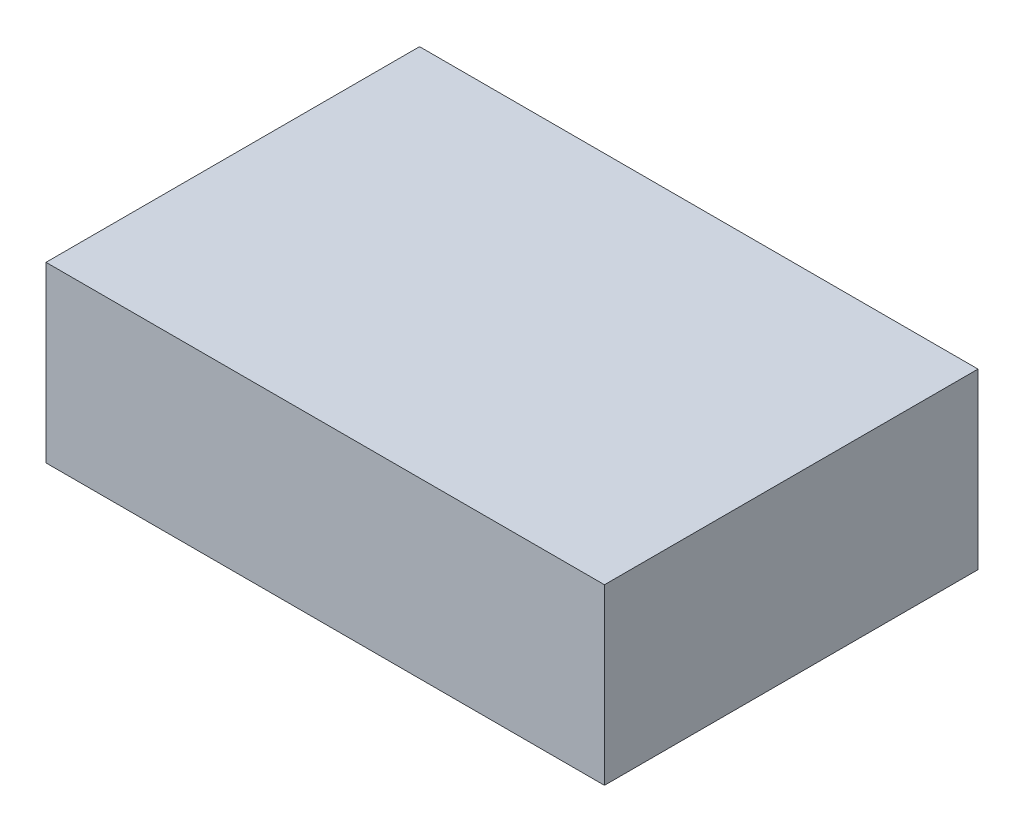
ISO-10303-21;
HEADER;
FILE_DESCRIPTION(('STEP AP214'),'2;1');
FILE_NAME('part.step','',(''),(''),'','','');
FILE_SCHEMA(('AUTOMOTIVE_DESIGN { 1 0 10303 214 1 1 1 1 }'));
ENDSEC;
DATA;
#1=APPLICATION_CONTEXT('core data for automotive mechanical design processes');
#2=APPLICATION_PROTOCOL_DEFINITION('international standard','automotive_design',2000,#1);
#3=PRODUCT_CONTEXT('',#1,'mechanical');
#4=PRODUCT('Part','Part','',(#3));
#5=PRODUCT_RELATED_PRODUCT_CATEGORY('part','',(#4));
#6=PRODUCT_DEFINITION_FORMATION('','',#4);
#7=PRODUCT_DEFINITION_CONTEXT('part definition',#1,'design');
#8=PRODUCT_DEFINITION('design','',#6,#7);
#9=PRODUCT_DEFINITION_SHAPE('','',#8);
#10=(LENGTH_UNIT() NAMED_UNIT(*) SI_UNIT(.MILLI.,.METRE.));
#11=(NAMED_UNIT(*) PLANE_ANGLE_UNIT() SI_UNIT($,.RADIAN.));
#12=(NAMED_UNIT(*) SI_UNIT($,.STERADIAN.) SOLID_ANGLE_UNIT());
#13=UNCERTAINTY_MEASURE_WITH_UNIT(LENGTH_MEASURE(1.E-05),#10,'distance_accuracy_value','');
#14=(GEOMETRIC_REPRESENTATION_CONTEXT(3) GLOBAL_UNCERTAINTY_ASSIGNED_CONTEXT((#13)) GLOBAL_UNIT_ASSIGNED_CONTEXT((#10,
#11,#12)) REPRESENTATION_CONTEXT('',''));
#15=CARTESIAN_POINT('',(0.,0.,0.));
#16=DIRECTION('',(0.,0.,1.));
#17=DIRECTION('',(1.,0.,0.));
#18=AXIS2_PLACEMENT_3D('',#15,#16,#17);
#19=CARTESIAN_POINT('',(45.,28.,-30.1));
#20=DIRECTION('',(-1.,0.,0.));
#21=DIRECTION('',(0.,0.,1.));
#22=AXIS2_PLACEMENT_3D('',#19,#20,#21);
#23=PLANE('',#22);
#24=DIRECTION('',(0.,0.,-1.));
#25=VECTOR('',#24,1.);
#26=CARTESIAN_POINT('',(45.,0.,-30.1));
#27=LINE('',#26,#25);
#28=CARTESIAN_POINT('',(45.,0.,30.1));
#29=VERTEX_POINT('',#28);
#30=CARTESIAN_POINT('',(45.,0.,-30.1));
#31=VERTEX_POINT('',#30);
#32=EDGE_CURVE('E106',#29,#31,#27,.T.);
#33=ORIENTED_EDGE('',*,*,#32,.T.);
#34=DIRECTION('',(0.,-1.,0.));
#35=VECTOR('',#34,1.);
#36=CARTESIAN_POINT('',(45.,28.,-30.1));
#37=LINE('',#36,#35);
#38=CARTESIAN_POINT('',(45.,28.,-30.1));
#39=VERTEX_POINT('',#38);
#40=EDGE_CURVE('E11',#39,#31,#37,.T.);
#41=ORIENTED_EDGE('',*,*,#40,.F.);
#42=DIRECTION('',(0.,0.,-1.));
#43=VECTOR('',#42,1.);
#44=CARTESIAN_POINT('',(45.,28.,-30.1));
#45=LINE('',#44,#43);
#46=CARTESIAN_POINT('',(45.,28.,30.1));
#47=VERTEX_POINT('',#46);
#48=EDGE_CURVE('E94',#47,#39,#45,.T.);
#49=ORIENTED_EDGE('',*,*,#48,.F.);
#50=DIRECTION('',(0.,-1.,0.));
#51=VECTOR('',#50,1.);
#52=CARTESIAN_POINT('',(45.,28.,30.1));
#53=LINE('',#52,#51);
#54=EDGE_CURVE('E102',#47,#29,#53,.T.);
#55=ORIENTED_EDGE('',*,*,#54,.T.);
#56=EDGE_LOOP('',(#33,#41,#49,#55));
#57=FACE_BOUND('',#56,.T.);
#58=ADVANCED_FACE('F43',(#57),#23,.F.);
#59=CARTESIAN_POINT('',(-45.,28.,-30.1));
#60=DIRECTION('',(0.,0.,1.));
#61=DIRECTION('',(1.,0.,0.));
#62=AXIS2_PLACEMENT_3D('',#59,#60,#61);
#63=PLANE('',#62);
#64=DIRECTION('',(-1.,0.,0.));
#65=VECTOR('',#64,1.);
#66=CARTESIAN_POINT('',(-45.,0.,-30.1));
#67=LINE('',#66,#65);
#68=CARTESIAN_POINT('',(-45.,0.,-30.1));
#69=VERTEX_POINT('',#68);
#70=EDGE_CURVE('E98',#31,#69,#67,.T.);
#71=ORIENTED_EDGE('',*,*,#70,.T.);
#72=DIRECTION('',(0.,-1.,0.));
#73=VECTOR('',#72,1.);
#74=CARTESIAN_POINT('',(-45.,28.,-30.1));
#75=LINE('',#74,#73);
#76=CARTESIAN_POINT('',(-45.,28.,-30.1));
#77=VERTEX_POINT('',#76);
#78=EDGE_CURVE('E51',#77,#69,#75,.T.);
#79=ORIENTED_EDGE('',*,*,#78,.F.);
#80=DIRECTION('',(-1.,0.,0.));
#81=VECTOR('',#80,1.);
#82=CARTESIAN_POINT('',(-45.,28.,-30.1));
#83=LINE('',#82,#81);
#84=EDGE_CURVE('E89',#39,#77,#83,.T.);
#85=ORIENTED_EDGE('',*,*,#84,.F.);
#86=ORIENTED_EDGE('',*,*,#40,.T.);
#87=EDGE_LOOP('',(#71,#79,#85,#86));
#88=FACE_BOUND('',#87,.T.);
#89=ADVANCED_FACE('F97',(#88),#63,.F.);
#90=CARTESIAN_POINT('',(-45.,28.,-30.1));
#91=DIRECTION('',(1.,0.,0.));
#92=DIRECTION('',(0.,0.,-1.));
#93=AXIS2_PLACEMENT_3D('',#90,#91,#92);
#94=PLANE('',#93);
#95=DIRECTION('',(0.,0.,1.));
#96=VECTOR('',#95,1.);
#97=CARTESIAN_POINT('',(-45.,0.,-30.1));
#98=LINE('',#97,#96);
#99=CARTESIAN_POINT('',(-45.,0.,30.1));
#100=VERTEX_POINT('',#99);
#101=EDGE_CURVE('E76',#69,#100,#98,.T.);
#102=ORIENTED_EDGE('',*,*,#101,.T.);
#103=DIRECTION('',(0.,-1.,0.));
#104=VECTOR('',#103,1.);
#105=CARTESIAN_POINT('',(-45.,28.,30.1));
#106=LINE('',#105,#104);
#107=CARTESIAN_POINT('',(-45.,28.,30.1));
#108=VERTEX_POINT('',#107);
#109=EDGE_CURVE('E99',#108,#100,#106,.T.);
#110=ORIENTED_EDGE('',*,*,#109,.F.);
#111=DIRECTION('',(0.,0.,1.));
#112=VECTOR('',#111,1.);
#113=CARTESIAN_POINT('',(-45.,28.,-30.1));
#114=LINE('',#113,#112);
#115=EDGE_CURVE('E92',#77,#108,#114,.T.);
#116=ORIENTED_EDGE('',*,*,#115,.F.);
#117=ORIENTED_EDGE('',*,*,#78,.T.);
#118=EDGE_LOOP('',(#102,#110,#116,#117));
#119=FACE_BOUND('',#118,.T.);
#120=ADVANCED_FACE('F100',(#119),#94,.F.);
#121=CARTESIAN_POINT('',(-45.,28.,30.1));
#122=DIRECTION('',(0.,0.,-1.));
#123=DIRECTION('',(-1.,0.,0.));
#124=AXIS2_PLACEMENT_3D('',#121,#122,#123);
#125=PLANE('',#124);
#126=DIRECTION('',(1.,0.,0.));
#127=VECTOR('',#126,1.);
#128=CARTESIAN_POINT('',(-45.,0.,30.1));
#129=LINE('',#128,#127);
#130=EDGE_CURVE('E82',#100,#29,#129,.T.);
#131=ORIENTED_EDGE('',*,*,#130,.T.);
#132=ORIENTED_EDGE('',*,*,#54,.F.);
#133=DIRECTION('',(1.,0.,0.));
#134=VECTOR('',#133,1.);
#135=CARTESIAN_POINT('',(-45.,28.,30.1));
#136=LINE('',#135,#134);
#137=EDGE_CURVE('E59',#108,#47,#136,.T.);
#138=ORIENTED_EDGE('',*,*,#137,.F.);
#139=ORIENTED_EDGE('',*,*,#109,.T.);
#140=EDGE_LOOP('',(#131,#132,#138,#139));
#141=FACE_BOUND('',#140,.T.);
#142=ADVANCED_FACE('F113',(#141),#125,.F.);
#143=CARTESIAN_POINT('',(0.,28.,0.));
#144=DIRECTION('',(0.,1.,0.));
#145=DIRECTION('',(0.,0.,1.));
#146=AXIS2_PLACEMENT_3D('',#143,#144,#145);
#147=PLANE('',#146);
#148=ORIENTED_EDGE('',*,*,#48,.T.);
#149=ORIENTED_EDGE('',*,*,#84,.T.);
#150=ORIENTED_EDGE('',*,*,#115,.T.);
#151=ORIENTED_EDGE('',*,*,#137,.T.);
#152=EDGE_LOOP('',(#148,#149,#150,#151));
#153=FACE_BOUND('',#152,.T.);
#154=ADVANCED_FACE('F90',(#153),#147,.T.);
#155=CARTESIAN_POINT('',(0.,0.,0.));
#156=DIRECTION('',(0.,1.,0.));
#157=DIRECTION('',(0.,0.,1.));
#158=AXIS2_PLACEMENT_3D('',#155,#156,#157);
#159=PLANE('',#158);
#160=ORIENTED_EDGE('',*,*,#32,.F.);
#161=ORIENTED_EDGE('',*,*,#130,.F.);
#162=ORIENTED_EDGE('',*,*,#101,.F.);
#163=ORIENTED_EDGE('',*,*,#70,.F.);
#164=EDGE_LOOP('',(#160,#161,#162,#163));
#165=FACE_BOUND('',#164,.T.);
#166=ADVANCED_FACE('F116',(#165),#159,.F.);
#167=CLOSED_SHELL('',(#58,#89,#120,#142,#154,#166));
#168=MANIFOLD_SOLID_BREP('B2',#167);
#169=ADVANCED_BREP_SHAPE_REPRESENTATION('',(#18,#168),#14);
#170=SHAPE_DEFINITION_REPRESENTATION(#9,#169);
ENDSEC;
END-ISO-10303-21;
